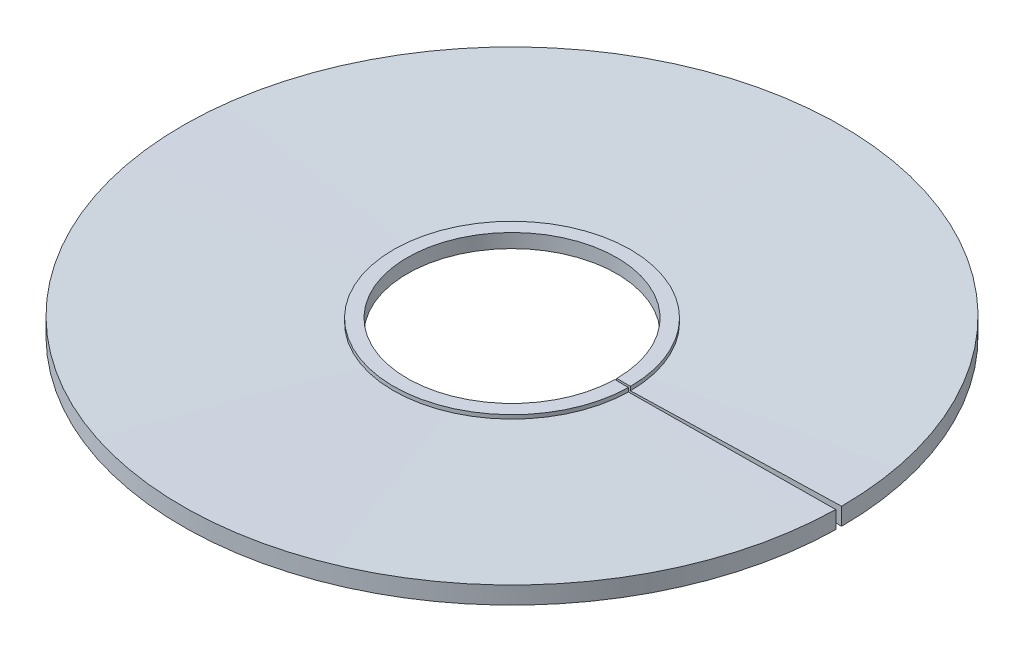
ISO-10303-21;
HEADER;
FILE_DESCRIPTION(('STEP AP214'),'2;1');
FILE_NAME('part.step','',(''),(''),'','','');
FILE_SCHEMA(('AUTOMOTIVE_DESIGN { 1 0 10303 214 1 1 1 1 }'));
ENDSEC;
DATA;
#1=APPLICATION_CONTEXT('core data for automotive mechanical design processes');
#2=APPLICATION_PROTOCOL_DEFINITION('international standard','automotive_design',2000,#1);
#3=PRODUCT_CONTEXT('',#1,'mechanical');
#4=PRODUCT('Part','Part','',(#3));
#5=PRODUCT_RELATED_PRODUCT_CATEGORY('part','',(#4));
#6=PRODUCT_DEFINITION_FORMATION('','',#4);
#7=PRODUCT_DEFINITION_CONTEXT('part definition',#1,'design');
#8=PRODUCT_DEFINITION('design','',#6,#7);
#9=PRODUCT_DEFINITION_SHAPE('','',#8);
#10=(LENGTH_UNIT() NAMED_UNIT(*) SI_UNIT(.MILLI.,.METRE.));
#11=(NAMED_UNIT(*) PLANE_ANGLE_UNIT() SI_UNIT($,.RADIAN.));
#12=(NAMED_UNIT(*) SI_UNIT($,.STERADIAN.) SOLID_ANGLE_UNIT());
#13=UNCERTAINTY_MEASURE_WITH_UNIT(LENGTH_MEASURE(1.E-05),#10,'distance_accuracy_value','');
#14=(GEOMETRIC_REPRESENTATION_CONTEXT(3) GLOBAL_UNCERTAINTY_ASSIGNED_CONTEXT((#13)) GLOBAL_UNIT_ASSIGNED_CONTEXT((#10,
#11,#12)) REPRESENTATION_CONTEXT('',''));
#15=CARTESIAN_POINT('',(0.,0.,0.));
#16=DIRECTION('',(0.,0.,1.));
#17=DIRECTION('',(1.,0.,0.));
#18=AXIS2_PLACEMENT_3D('',#15,#16,#17);
#19=CARTESIAN_POINT('',(0.,0.,0.));
#20=DIRECTION('',(0.,-1.,0.));
#21=DIRECTION('',(0.,0.,-1.));
#22=AXIS2_PLACEMENT_3D('',#19,#20,#21);
#23=CYLINDRICAL_SURFACE('',#22,43.1);
#24=CARTESIAN_POINT('',(0.,2.54,0.));
#25=DIRECTION('',(0.,-1.,0.));
#26=DIRECTION('',(0.,0.,-1.));
#27=AXIS2_PLACEMENT_3D('',#24,#25,#26);
#28=CIRCLE('',#27,43.1);
#29=CARTESIAN_POINT('',(43.0934356612405,2.54,0.752198717446309));
#30=VERTEX_POINT('',#29);
#31=CARTESIAN_POINT('',(43.1,2.54,0.));
#32=VERTEX_POINT('',#31);
#33=EDGE_CURVE('E11',#30,#32,#28,.T.);
#34=ORIENTED_EDGE('',*,*,#33,.T.);
#35=DIRECTION('',(0.,1.,0.));
#36=VECTOR('',#35,1.);
#37=CARTESIAN_POINT('',(43.1,1.143,0.));
#38=LINE('',#37,#36);
#39=CARTESIAN_POINT('',(43.1,1.143,0.));
#40=VERTEX_POINT('',#39);
#41=EDGE_CURVE('E99',#40,#32,#38,.T.);
#42=ORIENTED_EDGE('',*,*,#41,.F.);
#43=CARTESIAN_POINT('',(0.,1.143,0.));
#44=DIRECTION('',(0.,-1.,0.));
#45=DIRECTION('',(0.,0.,-1.));
#46=AXIS2_PLACEMENT_3D('',#43,#44,#45);
#47=CIRCLE('',#46,43.1);
#48=CARTESIAN_POINT('',(43.0934356612405,1.143,0.752198717446309));
#49=VERTEX_POINT('',#48);
#50=EDGE_CURVE('E50',#49,#40,#47,.T.);
#51=ORIENTED_EDGE('',*,*,#50,.F.);
#52=DIRECTION('',(0.,1.,0.));
#53=VECTOR('',#52,1.);
#54=CARTESIAN_POINT('',(43.0934356612405,1.143,0.752198717446309));
#55=LINE('',#54,#53);
#56=EDGE_CURVE('E101',#49,#30,#55,.T.);
#57=ORIENTED_EDGE('',*,*,#56,.T.);
#58=EDGE_LOOP('',(#34,#42,#51,#57));
#59=FACE_BOUND('',#58,.T.);
#60=ADVANCED_FACE('F35',(#59),#23,.T.);
#61=CARTESIAN_POINT('',(43.0934356612405,2.54,0.752198717446309));
#62=DIRECTION('',(0.,1.,0.));
#63=DIRECTION('',(0.,0.,1.));
#64=AXIS2_PLACEMENT_3D('',#61,#62,#63);
#65=PLANE('',#64);
#66=CARTESIAN_POINT('',(0.,2.54,0.));
#67=DIRECTION('',(0.,-1.,0.));
#68=DIRECTION('',(0.,0.,-1.));
#69=AXIS2_PLACEMENT_3D('',#66,#67,#68);
#70=CIRCLE('',#69,38.1);
#71=CARTESIAN_POINT('',(38.0941971854585,2.54,0.664936685259962));
#72=VERTEX_POINT('',#71);
#73=CARTESIAN_POINT('',(38.1,2.54,0.));
#74=VERTEX_POINT('',#73);
#75=EDGE_CURVE('E43',#72,#74,#70,.T.);
#76=ORIENTED_EDGE('',*,*,#75,.T.);
#77=DIRECTION('',(-1.,0.,0.));
#78=VECTOR('',#77,1.);
#79=CARTESIAN_POINT('',(43.1,2.54,0.));
#80=LINE('',#79,#78);
#81=EDGE_CURVE('E110',#32,#74,#80,.T.);
#82=ORIENTED_EDGE('',*,*,#81,.F.);
#83=ORIENTED_EDGE('',*,*,#33,.F.);
#84=DIRECTION('',(-0.999847695156391,0.,-0.0174524064372693));
#85=VECTOR('',#84,1.);
#86=CARTESIAN_POINT('',(43.0934356612405,2.54,0.752198717446309));
#87=LINE('',#86,#85);
#88=EDGE_CURVE('E132',#30,#72,#87,.T.);
#89=ORIENTED_EDGE('',*,*,#88,.T.);
#90=EDGE_LOOP('',(#76,#82,#83,#89));
#91=FACE_BOUND('',#90,.T.);
#92=ADVANCED_FACE('F37',(#91),#65,.T.);
#93=CARTESIAN_POINT('',(0.,0.,0.));
#94=DIRECTION('',(0.,-1.,0.));
#95=DIRECTION('',(0.,0.,-1.));
#96=AXIS2_PLACEMENT_3D('',#93,#94,#95);
#97=CYLINDRICAL_SURFACE('',#96,38.1);
#98=CARTESIAN_POINT('',(0.,-2.54,0.));
#99=DIRECTION('',(0.,-1.,0.));
#100=DIRECTION('',(0.,0.,-1.));
#101=AXIS2_PLACEMENT_3D('',#98,#99,#100);
#102=CIRCLE('',#101,38.1);
#103=CARTESIAN_POINT('',(38.0941971854585,-2.54,0.664936685259962));
#104=VERTEX_POINT('',#103);
#105=CARTESIAN_POINT('',(38.1,-2.54,0.));
#106=VERTEX_POINT('',#105);
#107=EDGE_CURVE('E158',#104,#106,#102,.T.);
#108=ORIENTED_EDGE('',*,*,#107,.T.);
#109=DIRECTION('',(0.,-1.,0.));
#110=VECTOR('',#109,1.);
#111=CARTESIAN_POINT('',(38.1,2.54,0.));
#112=LINE('',#111,#110);
#113=EDGE_CURVE('E115',#74,#106,#112,.T.);
#114=ORIENTED_EDGE('',*,*,#113,.F.);
#115=ORIENTED_EDGE('',*,*,#75,.F.);
#116=DIRECTION('',(0.,-1.,0.));
#117=VECTOR('',#116,1.);
#118=CARTESIAN_POINT('',(38.0941971854585,2.54,0.664936685259962));
#119=LINE('',#118,#117);
#120=EDGE_CURVE('E134',#72,#104,#119,.T.);
#121=ORIENTED_EDGE('',*,*,#120,.T.);
#122=EDGE_LOOP('',(#108,#114,#115,#121));
#123=FACE_BOUND('',#122,.T.);
#124=ADVANCED_FACE('F160',(#123),#97,.F.);
#125=CARTESIAN_POINT('',(38.0941971854585,-2.54,0.664936685259962));
#126=DIRECTION('',(0.,-1.,0.));
#127=DIRECTION('',(0.,0.,-1.));
#128=AXIS2_PLACEMENT_3D('',#125,#126,#127);
#129=PLANE('',#128);
#130=CARTESIAN_POINT('',(0.,-2.54,0.));
#131=DIRECTION('',(0.,-1.,0.));
#132=DIRECTION('',(0.,0.,-1.));
#133=AXIS2_PLACEMENT_3D('',#130,#131,#132);
#134=CIRCLE('',#133,43.1);
#135=CARTESIAN_POINT('',(43.0934356612405,-2.54,0.752198717446309));
#136=VERTEX_POINT('',#135);
#137=CARTESIAN_POINT('',(43.1,-2.54,0.));
#138=VERTEX_POINT('',#137);
#139=EDGE_CURVE('E156',#136,#138,#134,.T.);
#140=ORIENTED_EDGE('',*,*,#139,.T.);
#141=DIRECTION('',(1.,0.,0.));
#142=VECTOR('',#141,1.);
#143=CARTESIAN_POINT('',(38.1,-2.54,0.));
#144=LINE('',#143,#142);
#145=EDGE_CURVE('E117',#106,#138,#144,.T.);
#146=ORIENTED_EDGE('',*,*,#145,.F.);
#147=ORIENTED_EDGE('',*,*,#107,.F.);
#148=DIRECTION('',(0.999847695156391,0.,0.0174524064372693));
#149=VECTOR('',#148,1.);
#150=CARTESIAN_POINT('',(38.0941971854585,-2.54,0.664936685259962));
#151=LINE('',#150,#149);
#152=EDGE_CURVE('E137',#104,#136,#151,.T.);
#153=ORIENTED_EDGE('',*,*,#152,.T.);
#154=EDGE_LOOP('',(#140,#146,#147,#153));
#155=FACE_BOUND('',#154,.T.);
#156=ADVANCED_FACE('F166',(#155),#129,.T.);
#157=CARTESIAN_POINT('',(0.,0.,0.));
#158=DIRECTION('',(0.,-1.,0.));
#159=DIRECTION('',(0.,0.,-1.));
#160=AXIS2_PLACEMENT_3D('',#157,#158,#159);
#161=CYLINDRICAL_SURFACE('',#160,43.1);
#162=CARTESIAN_POINT('',(0.,-1.143,0.));
#163=DIRECTION('',(0.,-1.,0.));
#164=DIRECTION('',(0.,0.,-1.));
#165=AXIS2_PLACEMENT_3D('',#162,#163,#164);
#166=CIRCLE('',#165,43.1);
#167=CARTESIAN_POINT('',(43.0934356612405,-1.143,0.752198717446309));
#168=VERTEX_POINT('',#167);
#169=CARTESIAN_POINT('',(43.1,-1.143,0.));
#170=VERTEX_POINT('',#169);
#171=EDGE_CURVE('E154',#168,#170,#166,.T.);
#172=ORIENTED_EDGE('',*,*,#171,.T.);
#173=DIRECTION('',(0.,1.,0.));
#174=VECTOR('',#173,1.);
#175=CARTESIAN_POINT('',(43.1,-2.54,0.));
#176=LINE('',#175,#174);
#177=EDGE_CURVE('E122',#138,#170,#176,.T.);
#178=ORIENTED_EDGE('',*,*,#177,.F.);
#179=ORIENTED_EDGE('',*,*,#139,.F.);
#180=DIRECTION('',(0.,1.,0.));
#181=VECTOR('',#180,1.);
#182=CARTESIAN_POINT('',(43.0934356612405,-2.54,0.752198717446309));
#183=LINE('',#182,#181);
#184=EDGE_CURVE('E140',#136,#168,#183,.T.);
#185=ORIENTED_EDGE('',*,*,#184,.T.);
#186=EDGE_LOOP('',(#172,#178,#179,#185));
#187=FACE_BOUND('',#186,.T.);
#188=ADVANCED_FACE('F169',(#187),#161,.T.);
#189=CARTESIAN_POINT('',(0.,-1.143,0.));
#190=DIRECTION('',(0.,-1.,0.));
#191=DIRECTION('',(0.,0.,-1.));
#192=AXIS2_PLACEMENT_3D('',#189,#190,#191);
#193=CONICAL_SURFACE('',#192,43.1,1.54434003299582);
#194=CARTESIAN_POINT('',(0.,-3.175,0.));
#195=DIRECTION('',(0.,-1.,0.));
#196=DIRECTION('',(0.,0.,-1.));
#197=AXIS2_PLACEMENT_3D('',#194,#195,#196);
#198=CIRCLE('',#197,119.888);
#199=CARTESIAN_POINT('',(119.869740476909,-3.175,2.09233410295135));
#200=VERTEX_POINT('',#199);
#201=CARTESIAN_POINT('',(119.888,-3.175,0.));
#202=VERTEX_POINT('',#201);
#203=EDGE_CURVE('E152',#200,#202,#198,.T.);
#204=ORIENTED_EDGE('',*,*,#203,.T.);
#205=DIRECTION('',(0.999650052671635,-0.0264532076239616,0.));
#206=VECTOR('',#205,1.);
#207=CARTESIAN_POINT('',(43.1,-1.143,0.));
#208=LINE('',#207,#206);
#209=EDGE_CURVE('E125',#170,#202,#208,.T.);
#210=ORIENTED_EDGE('',*,*,#209,.F.);
#211=ORIENTED_EDGE('',*,*,#171,.F.);
#212=DIRECTION('',(0.9994978011267,-0.0264532076239616,0.0174462990142631));
#213=VECTOR('',#212,1.);
#214=CARTESIAN_POINT('',(43.0934356612405,-1.143,0.752198717446309));
#215=LINE('',#214,#213);
#216=EDGE_CURVE('E143',#168,#200,#215,.T.);
#217=ORIENTED_EDGE('',*,*,#216,.T.);
#218=EDGE_LOOP('',(#204,#210,#211,#217));
#219=FACE_BOUND('',#218,.T.);
#220=ADVANCED_FACE('F174',(#219),#193,.F.);
#221=CARTESIAN_POINT('',(0.,0.,0.));
#222=DIRECTION('',(0.,-1.,0.));
#223=DIRECTION('',(0.,0.,-1.));
#224=AXIS2_PLACEMENT_3D('',#221,#222,#223);
#225=CYLINDRICAL_SURFACE('',#224,119.888);
#226=CARTESIAN_POINT('',(0.,3.175,0.));
#227=DIRECTION('',(0.,-1.,0.));
#228=DIRECTION('',(0.,0.,-1.));
#229=AXIS2_PLACEMENT_3D('',#226,#227,#228);
#230=CIRCLE('',#229,119.888);
#231=CARTESIAN_POINT('',(119.869740476909,3.175,2.09233410295135));
#232=VERTEX_POINT('',#231);
#233=CARTESIAN_POINT('',(119.888,3.175,0.));
#234=VERTEX_POINT('',#233);
#235=EDGE_CURVE('E58',#232,#234,#230,.T.);
#236=ORIENTED_EDGE('',*,*,#235,.T.);
#237=DIRECTION('',(0.,1.,0.));
#238=VECTOR('',#237,1.);
#239=CARTESIAN_POINT('',(119.888,-3.175,0.));
#240=LINE('',#239,#238);
#241=EDGE_CURVE('E128',#202,#234,#240,.T.);
#242=ORIENTED_EDGE('',*,*,#241,.F.);
#243=ORIENTED_EDGE('',*,*,#203,.F.);
#244=DIRECTION('',(0.,1.,0.));
#245=VECTOR('',#244,1.);
#246=CARTESIAN_POINT('',(119.869740476909,-3.175,2.09233410295135));
#247=LINE('',#246,#245);
#248=EDGE_CURVE('E146',#200,#232,#247,.T.);
#249=ORIENTED_EDGE('',*,*,#248,.T.);
#250=EDGE_LOOP('',(#236,#242,#243,#249));
#251=FACE_BOUND('',#250,.T.);
#252=ADVANCED_FACE('F177',(#251),#225,.T.);
#253=CARTESIAN_POINT('',(0.,3.175,0.));
#254=DIRECTION('',(0.,1.,0.));
#255=DIRECTION('',(0.,0.,1.));
#256=AXIS2_PLACEMENT_3D('',#253,#254,#255);
#257=CONICAL_SURFACE('',#256,119.888,1.54434003299582);
#258=DIRECTION('',(-0.9994978011267,-0.0264532076239616,-0.0174462990142631));
#259=VECTOR('',#258,1.);
#260=CARTESIAN_POINT('',(119.869740476909,3.175,2.09233410295135));
#261=LINE('',#260,#259);
#262=EDGE_CURVE('E148',#232,#49,#261,.T.);
#263=ORIENTED_EDGE('',*,*,#262,.T.);
#264=ORIENTED_EDGE('',*,*,#50,.T.);
#265=DIRECTION('',(-0.999650052671635,-0.0264532076239616,0.));
#266=VECTOR('',#265,1.);
#267=CARTESIAN_POINT('',(119.888,3.175,0.));
#268=LINE('',#267,#266);
#269=EDGE_CURVE('E113',#234,#40,#268,.T.);
#270=ORIENTED_EDGE('',*,*,#269,.F.);
#271=ORIENTED_EDGE('',*,*,#235,.F.);
#272=EDGE_LOOP('',(#263,#264,#270,#271));
#273=FACE_BOUND('',#272,.T.);
#274=ADVANCED_FACE('F179',(#273),#257,.F.);
#275=CARTESIAN_POINT('',(0.,0.,0.));
#276=DIRECTION('',(-0.0174524064372693,0.,0.999847695156391));
#277=DIRECTION('',(0.999847695156391,0.,0.0174524064372693));
#278=AXIS2_PLACEMENT_3D('',#275,#276,#277);
#279=PLANE('',#278);
#280=ORIENTED_EDGE('',*,*,#56,.F.);
#281=ORIENTED_EDGE('',*,*,#262,.F.);
#282=ORIENTED_EDGE('',*,*,#248,.F.);
#283=ORIENTED_EDGE('',*,*,#216,.F.);
#284=ORIENTED_EDGE('',*,*,#184,.F.);
#285=ORIENTED_EDGE('',*,*,#152,.F.);
#286=ORIENTED_EDGE('',*,*,#120,.F.);
#287=ORIENTED_EDGE('',*,*,#88,.F.);
#288=EDGE_LOOP('',(#280,#281,#282,#283,#284,#285,#286,#287));
#289=FACE_BOUND('',#288,.T.);
#290=ADVANCED_FACE('F181',(#289),#279,.F.);
#291=CARTESIAN_POINT('',(0.,0.,0.));
#292=DIRECTION('',(0.,0.,1.));
#293=DIRECTION('',(1.,0.,0.));
#294=AXIS2_PLACEMENT_3D('',#291,#292,#293);
#295=PLANE('',#294);
#296=ORIENTED_EDGE('',*,*,#41,.T.);
#297=ORIENTED_EDGE('',*,*,#81,.T.);
#298=ORIENTED_EDGE('',*,*,#113,.T.);
#299=ORIENTED_EDGE('',*,*,#145,.T.);
#300=ORIENTED_EDGE('',*,*,#177,.T.);
#301=ORIENTED_EDGE('',*,*,#209,.T.);
#302=ORIENTED_EDGE('',*,*,#241,.T.);
#303=ORIENTED_EDGE('',*,*,#269,.T.);
#304=EDGE_LOOP('',(#296,#297,#298,#299,#300,#301,#302,#303));
#305=FACE_BOUND('',#304,.T.);
#306=ADVANCED_FACE('F108',(#305),#295,.T.);
#307=CLOSED_SHELL('',(#60,#92,#124,#156,#188,#220,#252,#274,#290,#306));
#308=MANIFOLD_SOLID_BREP('B2',#307);
#309=ADVANCED_BREP_SHAPE_REPRESENTATION('',(#18,#308),#14);
#310=SHAPE_DEFINITION_REPRESENTATION(#9,#309);
ENDSEC;
END-ISO-10303-21;
